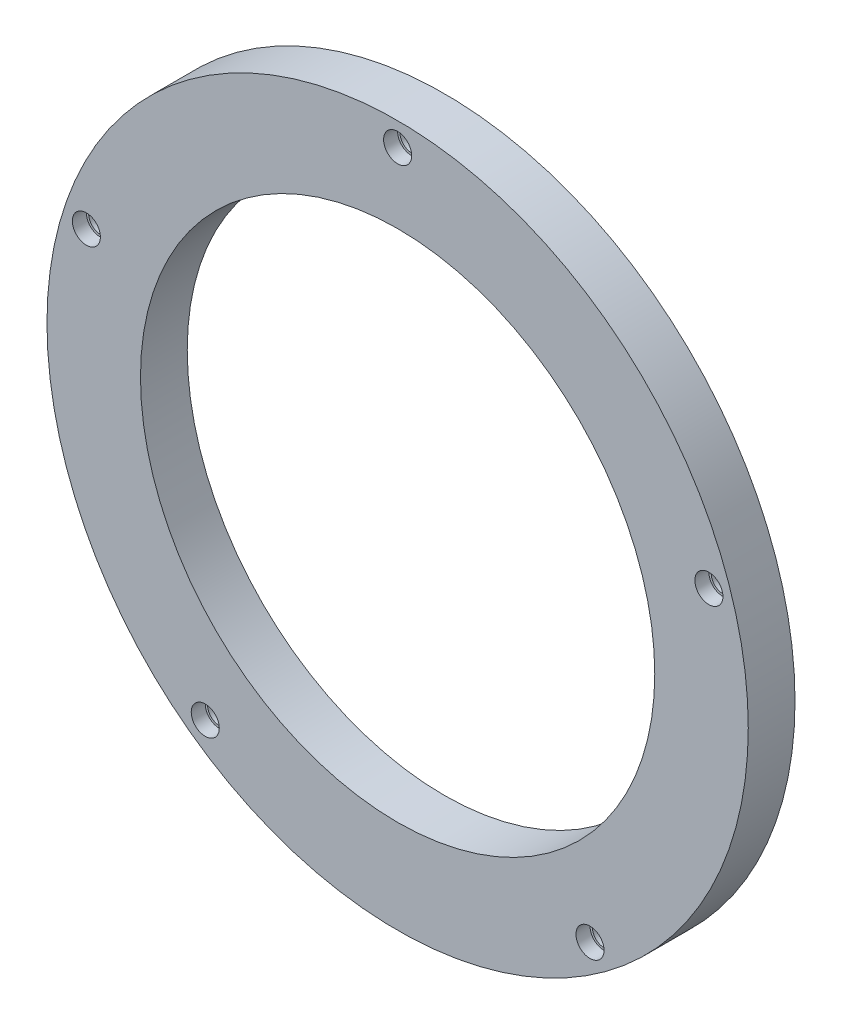
ISO-10303-21;
HEADER;
FILE_DESCRIPTION(('STEP AP214'),'2;1');
FILE_NAME('part.step','',(''),(''),'','','');
FILE_SCHEMA(('AUTOMOTIVE_DESIGN { 1 0 10303 214 1 1 1 1 }'));
ENDSEC;
DATA;
#1=APPLICATION_CONTEXT('core data for automotive mechanical design processes');
#2=APPLICATION_PROTOCOL_DEFINITION('international standard','automotive_design',2000,#1);
#3=PRODUCT_CONTEXT('',#1,'mechanical');
#4=PRODUCT('Part','Part','',(#3));
#5=PRODUCT_RELATED_PRODUCT_CATEGORY('part','',(#4));
#6=PRODUCT_DEFINITION_FORMATION('','',#4);
#7=PRODUCT_DEFINITION_CONTEXT('part definition',#1,'design');
#8=PRODUCT_DEFINITION('design','',#6,#7);
#9=PRODUCT_DEFINITION_SHAPE('','',#8);
#10=(LENGTH_UNIT() NAMED_UNIT(*) SI_UNIT(.MILLI.,.METRE.));
#11=(NAMED_UNIT(*) PLANE_ANGLE_UNIT() SI_UNIT($,.RADIAN.));
#12=(NAMED_UNIT(*) SI_UNIT($,.STERADIAN.) SOLID_ANGLE_UNIT());
#13=UNCERTAINTY_MEASURE_WITH_UNIT(LENGTH_MEASURE(1.E-05),#10,'distance_accuracy_value','');
#14=(GEOMETRIC_REPRESENTATION_CONTEXT(3) GLOBAL_UNCERTAINTY_ASSIGNED_CONTEXT((#13)) GLOBAL_UNIT_ASSIGNED_CONTEXT((#10,
#11,#12)) REPRESENTATION_CONTEXT('',''));
#15=CARTESIAN_POINT('',(0.,0.,0.));
#16=DIRECTION('',(0.,0.,1.));
#17=DIRECTION('',(1.,0.,0.));
#18=AXIS2_PLACEMENT_3D('',#15,#16,#17);
#19=CARTESIAN_POINT('',(0.,0.,10.));
#20=DIRECTION('',(0.,0.,-1.));
#21=DIRECTION('',(-1.,0.,0.));
#22=AXIS2_PLACEMENT_3D('',#19,#20,#21);
#23=CYLINDRICAL_SURFACE('',#22,75.);
#24=CARTESIAN_POINT('',(0.,0.,10.));
#25=DIRECTION('',(0.,0.,1.));
#26=DIRECTION('',(1.,0.,0.));
#27=AXIS2_PLACEMENT_3D('',#24,#25,#26);
#28=CIRCLE('',#27,75.);
#29=CARTESIAN_POINT('',(75.,0.,10.));
#30=VERTEX_POINT('',#29);
#31=EDGE_CURVE('E10',#30,#30,#28,.T.);
#32=ORIENTED_EDGE('',*,*,#31,.F.);
#33=EDGE_LOOP('',(#32));
#34=FACE_BOUND('',#33,.T.);
#35=CARTESIAN_POINT('',(0.,0.,0.));
#36=DIRECTION('',(0.,0.,1.));
#37=DIRECTION('',(1.,0.,0.));
#38=AXIS2_PLACEMENT_3D('',#35,#36,#37);
#39=CIRCLE('',#38,75.);
#40=CARTESIAN_POINT('',(75.,0.,0.));
#41=VERTEX_POINT('',#40);
#42=EDGE_CURVE('E48',#41,#41,#39,.T.);
#43=ORIENTED_EDGE('',*,*,#42,.T.);
#44=EDGE_LOOP('',(#43));
#45=FACE_BOUND('',#44,.T.);
#46=ADVANCED_FACE('F41',(#34,#45),#23,.T.);
#47=CARTESIAN_POINT('',(0.,0.,10.));
#48=DIRECTION('',(0.,0.,1.));
#49=DIRECTION('',(1.,0.,0.));
#50=AXIS2_PLACEMENT_3D('',#47,#48,#49);
#51=PLANE('',#50);
#52=CARTESIAN_POINT('',(66.5739561406609,21.6311896062461,10.));
#53=DIRECTION('',(0.,0.,1.));
#54=DIRECTION('',(0.309016994374945,-0.951056516295155,0.));
#55=AXIS2_PLACEMENT_3D('',#52,#53,#54);
#56=CIRCLE('',#55,3.);
#57=CARTESIAN_POINT('',(67.5010071237857,18.7780200573607,10.));
#58=VERTEX_POINT('',#57);
#59=EDGE_CURVE('E196',#58,#58,#56,.T.);
#60=ORIENTED_EDGE('',*,*,#59,.F.);
#61=EDGE_LOOP('',(#60));
#62=FACE_BOUND('',#61,.T.);
#63=CARTESIAN_POINT('',(41.1449676604728,-56.6311896062466,10.));
#64=DIRECTION('',(0.,0.,1.));
#65=DIRECTION('',(-0.809016994374951,-0.587785252292469,0.));
#66=AXIS2_PLACEMENT_3D('',#63,#64,#65);
#67=CIRCLE('',#66,3.);
#68=CARTESIAN_POINT('',(38.717916677348,-58.394545363124,10.));
#69=VERTEX_POINT('',#68);
#70=EDGE_CURVE('E202',#69,#69,#67,.T.);
#71=ORIENTED_EDGE('',*,*,#70,.F.);
#72=EDGE_LOOP('',(#71));
#73=FACE_BOUND('',#72,.T.);
#74=CARTESIAN_POINT('',(-41.1449676604736,-56.631189606246,10.));
#75=DIRECTION('',(0.,0.,1.));
#76=DIRECTION('',(-0.809016994374942,0.58778525229248,0.));
#77=AXIS2_PLACEMENT_3D('',#74,#75,#76);
#78=CIRCLE('',#77,3.);
#79=CARTESIAN_POINT('',(-43.5720186435985,-54.8678338493685,10.));
#80=VERTEX_POINT('',#79);
#81=EDGE_CURVE('E84',#80,#80,#78,.T.);
#82=ORIENTED_EDGE('',*,*,#81,.F.);
#83=EDGE_LOOP('',(#82));
#84=FACE_BOUND('',#83,.T.);
#85=CARTESIAN_POINT('',(-66.5739561406605,21.6311896062471,10.));
#86=DIRECTION('',(0.,0.,1.));
#87=DIRECTION('',(0.309016994374958,0.95105651629515,0.));
#88=AXIS2_PLACEMENT_3D('',#85,#86,#87);
#89=CIRCLE('',#88,3.);
#90=CARTESIAN_POINT('',(-65.6469051575357,24.4843591551325,10.));
#91=VERTEX_POINT('',#90);
#92=EDGE_CURVE('E75',#91,#91,#89,.T.);
#93=ORIENTED_EDGE('',*,*,#92,.F.);
#94=EDGE_LOOP('',(#93));
#95=FACE_BOUND('',#94,.T.);
#96=CARTESIAN_POINT('',(0.,70.,10.));
#97=DIRECTION('',(0.,0.,1.));
#98=DIRECTION('',(1.,0.,0.));
#99=AXIS2_PLACEMENT_3D('',#96,#97,#98);
#100=CIRCLE('',#99,3.);
#101=CARTESIAN_POINT('',(3.,70.,10.));
#102=VERTEX_POINT('',#101);
#103=EDGE_CURVE('E62',#102,#102,#100,.T.);
#104=ORIENTED_EDGE('',*,*,#103,.F.);
#105=EDGE_LOOP('',(#104));
#106=FACE_BOUND('',#105,.T.);
#107=CARTESIAN_POINT('',(0.,0.,10.));
#108=DIRECTION('',(0.,0.,1.));
#109=DIRECTION('',(1.,0.,0.));
#110=AXIS2_PLACEMENT_3D('',#107,#108,#109);
#111=CIRCLE('',#110,55.);
#112=CARTESIAN_POINT('',(55.,0.,10.));
#113=VERTEX_POINT('',#112);
#114=EDGE_CURVE('E56',#113,#113,#111,.T.);
#115=ORIENTED_EDGE('',*,*,#114,.F.);
#116=EDGE_LOOP('',(#115));
#117=FACE_BOUND('',#116,.T.);
#118=ORIENTED_EDGE('',*,*,#31,.T.);
#119=EDGE_LOOP('',(#118));
#120=FACE_BOUND('',#119,.T.);
#121=ADVANCED_FACE('F103',(#62,#73,#84,#95,#106,#117,#120),#51,.T.);
#122=CARTESIAN_POINT('',(0.,0.,0.));
#123=DIRECTION('',(0.,0.,1.));
#124=DIRECTION('',(1.,0.,0.));
#125=AXIS2_PLACEMENT_3D('',#122,#123,#124);
#126=PLANE('',#125);
#127=CARTESIAN_POINT('',(66.5739561406609,21.6311896062461,0.));
#128=DIRECTION('',(0.,0.,1.));
#129=DIRECTION('',(0.309016994374945,-0.951056516295155,0.));
#130=AXIS2_PLACEMENT_3D('',#127,#128,#129);
#131=CIRCLE('',#130,2.5);
#132=CARTESIAN_POINT('',(67.3464986265982,19.2535483155083,0.));
#133=VERTEX_POINT('',#132);
#134=EDGE_CURVE('E68',#133,#133,#131,.T.);
#135=ORIENTED_EDGE('',*,*,#134,.T.);
#136=EDGE_LOOP('',(#135));
#137=FACE_BOUND('',#136,.T.);
#138=CARTESIAN_POINT('',(41.1449676604728,-56.6311896062466,0.));
#139=DIRECTION('',(0.,0.,1.));
#140=DIRECTION('',(-0.809016994374951,-0.587785252292469,0.));
#141=AXIS2_PLACEMENT_3D('',#138,#139,#140);
#142=CIRCLE('',#141,2.5);
#143=CARTESIAN_POINT('',(39.1224251745354,-58.1006527369777,0.));
#144=VERTEX_POINT('',#143);
#145=EDGE_CURVE('E183',#144,#144,#142,.T.);
#146=ORIENTED_EDGE('',*,*,#145,.T.);
#147=EDGE_LOOP('',(#146));
#148=FACE_BOUND('',#147,.T.);
#149=CARTESIAN_POINT('',(-41.1449676604736,-56.631189606246,0.));
#150=DIRECTION('',(0.,0.,1.));
#151=DIRECTION('',(-0.809016994374942,0.58778525229248,0.));
#152=AXIS2_PLACEMENT_3D('',#149,#150,#151);
#153=CIRCLE('',#152,2.5);
#154=CARTESIAN_POINT('',(-43.167510146411,-55.1617264755148,0.));
#155=VERTEX_POINT('',#154);
#156=EDGE_CURVE('E186',#155,#155,#153,.T.);
#157=ORIENTED_EDGE('',*,*,#156,.T.);
#158=EDGE_LOOP('',(#157));
#159=FACE_BOUND('',#158,.T.);
#160=CARTESIAN_POINT('',(-66.5739561406605,21.6311896062471,0.));
#161=DIRECTION('',(0.,0.,1.));
#162=DIRECTION('',(0.309016994374958,0.95105651629515,0.));
#163=AXIS2_PLACEMENT_3D('',#160,#161,#162);
#164=CIRCLE('',#163,2.5);
#165=CARTESIAN_POINT('',(-65.8014136547231,24.008830896985,0.));
#166=VERTEX_POINT('',#165);
#167=EDGE_CURVE('E191',#166,#166,#164,.T.);
#168=ORIENTED_EDGE('',*,*,#167,.T.);
#169=EDGE_LOOP('',(#168));
#170=FACE_BOUND('',#169,.T.);
#171=CARTESIAN_POINT('',(0.,70.,0.));
#172=DIRECTION('',(0.,0.,1.));
#173=DIRECTION('',(1.,0.,0.));
#174=AXIS2_PLACEMENT_3D('',#171,#172,#173);
#175=CIRCLE('',#174,2.5);
#176=CARTESIAN_POINT('',(2.5,70.,0.));
#177=VERTEX_POINT('',#176);
#178=EDGE_CURVE('E63',#177,#177,#175,.T.);
#179=ORIENTED_EDGE('',*,*,#178,.T.);
#180=EDGE_LOOP('',(#179));
#181=FACE_BOUND('',#180,.T.);
#182=CARTESIAN_POINT('',(0.,0.,0.));
#183=DIRECTION('',(0.,0.,1.));
#184=DIRECTION('',(1.,0.,0.));
#185=AXIS2_PLACEMENT_3D('',#182,#183,#184);
#186=CIRCLE('',#185,55.);
#187=CARTESIAN_POINT('',(55.,0.,0.));
#188=VERTEX_POINT('',#187);
#189=EDGE_CURVE('E53',#188,#188,#186,.T.);
#190=ORIENTED_EDGE('',*,*,#189,.T.);
#191=EDGE_LOOP('',(#190));
#192=FACE_BOUND('',#191,.T.);
#193=ORIENTED_EDGE('',*,*,#42,.F.);
#194=EDGE_LOOP('',(#193));
#195=FACE_BOUND('',#194,.T.);
#196=ADVANCED_FACE('F105',(#137,#148,#159,#170,#181,#192,#195),#126,.F.);
#197=CARTESIAN_POINT('',(0.,0.,0.));
#198=DIRECTION('',(0.,0.,1.));
#199=DIRECTION('',(1.,0.,0.));
#200=AXIS2_PLACEMENT_3D('',#197,#198,#199);
#201=CYLINDRICAL_SURFACE('',#200,55.);
#202=ORIENTED_EDGE('',*,*,#189,.F.);
#203=EDGE_LOOP('',(#202));
#204=FACE_BOUND('',#203,.T.);
#205=ORIENTED_EDGE('',*,*,#114,.T.);
#206=EDGE_LOOP('',(#205));
#207=FACE_BOUND('',#206,.T.);
#208=ADVANCED_FACE('F101',(#204,#207),#201,.F.);
#209=CARTESIAN_POINT('',(0.,70.,7.));
#210=DIRECTION('',(0.,0.,1.));
#211=DIRECTION('',(1.,0.,0.));
#212=AXIS2_PLACEMENT_3D('',#209,#210,#211);
#213=CYLINDRICAL_SURFACE('',#212,3.);
#214=CARTESIAN_POINT('',(0.,70.,7.));
#215=DIRECTION('',(0.,0.,1.));
#216=DIRECTION('',(1.,0.,0.));
#217=AXIS2_PLACEMENT_3D('',#214,#215,#216);
#218=CIRCLE('',#217,3.);
#219=CARTESIAN_POINT('',(3.,70.,7.));
#220=VERTEX_POINT('',#219);
#221=EDGE_CURVE('E91',#220,#220,#218,.T.);
#222=ORIENTED_EDGE('',*,*,#221,.F.);
#223=EDGE_LOOP('',(#222));
#224=FACE_BOUND('',#223,.T.);
#225=ORIENTED_EDGE('',*,*,#103,.T.);
#226=EDGE_LOOP('',(#225));
#227=FACE_BOUND('',#226,.T.);
#228=ADVANCED_FACE('F119',(#224,#227),#213,.F.);
#229=CARTESIAN_POINT('',(0.,70.,7.));
#230=DIRECTION('',(0.,0.,1.));
#231=DIRECTION('',(1.,0.,0.));
#232=AXIS2_PLACEMENT_3D('',#229,#230,#231);
#233=PLANE('',#232);
#234=CARTESIAN_POINT('',(0.,70.,7.));
#235=DIRECTION('',(0.,0.,1.));
#236=DIRECTION('',(1.,0.,0.));
#237=AXIS2_PLACEMENT_3D('',#234,#235,#236);
#238=CIRCLE('',#237,2.5);
#239=CARTESIAN_POINT('',(2.5,70.,7.));
#240=VERTEX_POINT('',#239);
#241=EDGE_CURVE('E59',#240,#240,#238,.T.);
#242=ORIENTED_EDGE('',*,*,#241,.F.);
#243=EDGE_LOOP('',(#242));
#244=FACE_BOUND('',#243,.T.);
#245=ORIENTED_EDGE('',*,*,#221,.T.);
#246=EDGE_LOOP('',(#245));
#247=FACE_BOUND('',#246,.T.);
#248=ADVANCED_FACE('F123',(#244,#247),#233,.T.);
#249=CARTESIAN_POINT('',(0.,70.,0.));
#250=DIRECTION('',(0.,0.,1.));
#251=DIRECTION('',(1.,0.,0.));
#252=AXIS2_PLACEMENT_3D('',#249,#250,#251);
#253=CYLINDRICAL_SURFACE('',#252,2.5);
#254=ORIENTED_EDGE('',*,*,#241,.T.);
#255=EDGE_LOOP('',(#254));
#256=FACE_BOUND('',#255,.T.);
#257=ORIENTED_EDGE('',*,*,#178,.F.);
#258=EDGE_LOOP('',(#257));
#259=FACE_BOUND('',#258,.T.);
#260=ADVANCED_FACE('F127',(#256,#259),#253,.F.);
#261=CARTESIAN_POINT('',(-66.5739561406605,21.6311896062471,7.));
#262=DIRECTION('',(0.,0.,1.));
#263=DIRECTION('',(1.,0.,0.));
#264=AXIS2_PLACEMENT_3D('',#261,#262,#263);
#265=CYLINDRICAL_SURFACE('',#264,3.);
#266=CARTESIAN_POINT('',(-66.5739561406605,21.6311896062471,7.));
#267=DIRECTION('',(0.,0.,1.));
#268=DIRECTION('',(0.309016994374958,0.95105651629515,0.));
#269=AXIS2_PLACEMENT_3D('',#266,#267,#268);
#270=CIRCLE('',#269,3.);
#271=CARTESIAN_POINT('',(-65.6469051575357,24.4843591551325,7.));
#272=VERTEX_POINT('',#271);
#273=EDGE_CURVE('E79',#272,#272,#270,.T.);
#274=ORIENTED_EDGE('',*,*,#273,.F.);
#275=EDGE_LOOP('',(#274));
#276=FACE_BOUND('',#275,.T.);
#277=ORIENTED_EDGE('',*,*,#92,.T.);
#278=EDGE_LOOP('',(#277));
#279=FACE_BOUND('',#278,.T.);
#280=ADVANCED_FACE('F131',(#276,#279),#265,.F.);
#281=CARTESIAN_POINT('',(-66.5739561406605,21.6311896062471,7.));
#282=DIRECTION('',(0.,0.,1.));
#283=DIRECTION('',(0.309016994374958,0.95105651629515,0.));
#284=AXIS2_PLACEMENT_3D('',#281,#282,#283);
#285=PLANE('',#284);
#286=CARTESIAN_POINT('',(-66.5739561406605,21.6311896062471,7.));
#287=DIRECTION('',(0.,0.,1.));
#288=DIRECTION('',(1.,0.,0.));
#289=AXIS2_PLACEMENT_3D('',#286,#287,#288);
#290=CIRCLE('',#289,2.5);
#291=CARTESIAN_POINT('',(-64.0739561406605,21.6311896062471,7.));
#292=VERTEX_POINT('',#291);
#293=EDGE_CURVE('E44',#292,#292,#290,.T.);
#294=ORIENTED_EDGE('',*,*,#293,.F.);
#295=EDGE_LOOP('',(#294));
#296=FACE_BOUND('',#295,.T.);
#297=ORIENTED_EDGE('',*,*,#273,.T.);
#298=EDGE_LOOP('',(#297));
#299=FACE_BOUND('',#298,.T.);
#300=ADVANCED_FACE('F135',(#296,#299),#285,.T.);
#301=CARTESIAN_POINT('',(-41.1449676604736,-56.631189606246,7.));
#302=DIRECTION('',(0.,0.,1.));
#303=DIRECTION('',(1.,0.,0.));
#304=AXIS2_PLACEMENT_3D('',#301,#302,#303);
#305=CYLINDRICAL_SURFACE('',#304,3.);
#306=CARTESIAN_POINT('',(-41.1449676604736,-56.631189606246,7.));
#307=DIRECTION('',(0.,0.,1.));
#308=DIRECTION('',(-0.809016994374942,0.58778525229248,0.));
#309=AXIS2_PLACEMENT_3D('',#306,#307,#308);
#310=CIRCLE('',#309,3.);
#311=CARTESIAN_POINT('',(-43.5720186435985,-54.8678338493685,7.));
#312=VERTEX_POINT('',#311);
#313=EDGE_CURVE('E205',#312,#312,#310,.T.);
#314=ORIENTED_EDGE('',*,*,#313,.F.);
#315=EDGE_LOOP('',(#314));
#316=FACE_BOUND('',#315,.T.);
#317=ORIENTED_EDGE('',*,*,#81,.T.);
#318=EDGE_LOOP('',(#317));
#319=FACE_BOUND('',#318,.T.);
#320=ADVANCED_FACE('F139',(#316,#319),#305,.F.);
#321=CARTESIAN_POINT('',(-41.1449676604736,-56.631189606246,7.));
#322=DIRECTION('',(0.,0.,1.));
#323=DIRECTION('',(-0.809016994374942,0.58778525229248,0.));
#324=AXIS2_PLACEMENT_3D('',#321,#322,#323);
#325=PLANE('',#324);
#326=CARTESIAN_POINT('',(-41.1449676604736,-56.631189606246,7.));
#327=DIRECTION('',(0.,0.,1.));
#328=DIRECTION('',(1.,0.,0.));
#329=AXIS2_PLACEMENT_3D('',#326,#327,#328);
#330=CIRCLE('',#329,2.5);
#331=CARTESIAN_POINT('',(-38.6449676604736,-56.631189606246,7.));
#332=VERTEX_POINT('',#331);
#333=EDGE_CURVE('E70',#332,#332,#330,.T.);
#334=ORIENTED_EDGE('',*,*,#333,.F.);
#335=EDGE_LOOP('',(#334));
#336=FACE_BOUND('',#335,.T.);
#337=ORIENTED_EDGE('',*,*,#313,.T.);
#338=EDGE_LOOP('',(#337));
#339=FACE_BOUND('',#338,.T.);
#340=ADVANCED_FACE('F143',(#336,#339),#325,.T.);
#341=CARTESIAN_POINT('',(41.1449676604728,-56.6311896062466,7.));
#342=DIRECTION('',(0.,0.,1.));
#343=DIRECTION('',(1.,0.,0.));
#344=AXIS2_PLACEMENT_3D('',#341,#342,#343);
#345=CYLINDRICAL_SURFACE('',#344,3.);
#346=CARTESIAN_POINT('',(41.1449676604728,-56.6311896062466,7.));
#347=DIRECTION('',(0.,0.,1.));
#348=DIRECTION('',(-0.809016994374951,-0.587785252292469,0.));
#349=AXIS2_PLACEMENT_3D('',#346,#347,#348);
#350=CIRCLE('',#349,3.);
#351=CARTESIAN_POINT('',(38.717916677348,-58.394545363124,7.));
#352=VERTEX_POINT('',#351);
#353=EDGE_CURVE('E199',#352,#352,#350,.T.);
#354=ORIENTED_EDGE('',*,*,#353,.F.);
#355=EDGE_LOOP('',(#354));
#356=FACE_BOUND('',#355,.T.);
#357=ORIENTED_EDGE('',*,*,#70,.T.);
#358=EDGE_LOOP('',(#357));
#359=FACE_BOUND('',#358,.T.);
#360=ADVANCED_FACE('F147',(#356,#359),#345,.F.);
#361=CARTESIAN_POINT('',(41.1449676604728,-56.6311896062466,7.));
#362=DIRECTION('',(0.,0.,1.));
#363=DIRECTION('',(-0.809016994374951,-0.587785252292469,0.));
#364=AXIS2_PLACEMENT_3D('',#361,#362,#363);
#365=PLANE('',#364);
#366=CARTESIAN_POINT('',(41.1449676604728,-56.6311896062466,7.));
#367=DIRECTION('',(0.,0.,1.));
#368=DIRECTION('',(1.,0.,0.));
#369=AXIS2_PLACEMENT_3D('',#366,#367,#368);
#370=CIRCLE('',#369,2.5);
#371=CARTESIAN_POINT('',(43.6449676604728,-56.6311896062466,7.));
#372=VERTEX_POINT('',#371);
#373=EDGE_CURVE('E67',#372,#372,#370,.T.);
#374=ORIENTED_EDGE('',*,*,#373,.F.);
#375=EDGE_LOOP('',(#374));
#376=FACE_BOUND('',#375,.T.);
#377=ORIENTED_EDGE('',*,*,#353,.T.);
#378=EDGE_LOOP('',(#377));
#379=FACE_BOUND('',#378,.T.);
#380=ADVANCED_FACE('F151',(#376,#379),#365,.T.);
#381=CARTESIAN_POINT('',(66.5739561406609,21.6311896062461,7.));
#382=DIRECTION('',(0.,0.,1.));
#383=DIRECTION('',(1.,0.,0.));
#384=AXIS2_PLACEMENT_3D('',#381,#382,#383);
#385=CYLINDRICAL_SURFACE('',#384,3.);
#386=CARTESIAN_POINT('',(66.5739561406609,21.6311896062461,7.));
#387=DIRECTION('',(0.,0.,1.));
#388=DIRECTION('',(0.309016994374945,-0.951056516295155,0.));
#389=AXIS2_PLACEMENT_3D('',#386,#387,#388);
#390=CIRCLE('',#389,3.);
#391=CARTESIAN_POINT('',(67.5010071237857,18.7780200573607,7.));
#392=VERTEX_POINT('',#391);
#393=EDGE_CURVE('E90',#392,#392,#390,.T.);
#394=ORIENTED_EDGE('',*,*,#393,.F.);
#395=EDGE_LOOP('',(#394));
#396=FACE_BOUND('',#395,.T.);
#397=ORIENTED_EDGE('',*,*,#59,.T.);
#398=EDGE_LOOP('',(#397));
#399=FACE_BOUND('',#398,.T.);
#400=ADVANCED_FACE('F155',(#396,#399),#385,.F.);
#401=CARTESIAN_POINT('',(66.5739561406609,21.6311896062461,7.));
#402=DIRECTION('',(0.,0.,1.));
#403=DIRECTION('',(0.309016994374945,-0.951056516295155,0.));
#404=AXIS2_PLACEMENT_3D('',#401,#402,#403);
#405=PLANE('',#404);
#406=CARTESIAN_POINT('',(66.5739561406609,21.6311896062461,7.));
#407=DIRECTION('',(0.,0.,1.));
#408=DIRECTION('',(1.,0.,0.));
#409=AXIS2_PLACEMENT_3D('',#406,#407,#408);
#410=CIRCLE('',#409,2.5);
#411=CARTESIAN_POINT('',(69.0739561406609,21.6311896062461,7.));
#412=VERTEX_POINT('',#411);
#413=EDGE_CURVE('E64',#412,#412,#410,.T.);
#414=ORIENTED_EDGE('',*,*,#413,.F.);
#415=EDGE_LOOP('',(#414));
#416=FACE_BOUND('',#415,.T.);
#417=ORIENTED_EDGE('',*,*,#393,.T.);
#418=EDGE_LOOP('',(#417));
#419=FACE_BOUND('',#418,.T.);
#420=ADVANCED_FACE('F159',(#416,#419),#405,.T.);
#421=CARTESIAN_POINT('',(66.5739561406609,21.6311896062461,0.));
#422=DIRECTION('',(0.,0.,1.));
#423=DIRECTION('',(1.,0.,0.));
#424=AXIS2_PLACEMENT_3D('',#421,#422,#423);
#425=CYLINDRICAL_SURFACE('',#424,2.5);
#426=ORIENTED_EDGE('',*,*,#413,.T.);
#427=EDGE_LOOP('',(#426));
#428=FACE_BOUND('',#427,.T.);
#429=ORIENTED_EDGE('',*,*,#134,.F.);
#430=EDGE_LOOP('',(#429));
#431=FACE_BOUND('',#430,.T.);
#432=ADVANCED_FACE('F163',(#428,#431),#425,.F.);
#433=CARTESIAN_POINT('',(41.1449676604728,-56.6311896062466,0.));
#434=DIRECTION('',(0.,0.,1.));
#435=DIRECTION('',(1.,0.,0.));
#436=AXIS2_PLACEMENT_3D('',#433,#434,#435);
#437=CYLINDRICAL_SURFACE('',#436,2.5);
#438=ORIENTED_EDGE('',*,*,#373,.T.);
#439=EDGE_LOOP('',(#438));
#440=FACE_BOUND('',#439,.T.);
#441=ORIENTED_EDGE('',*,*,#145,.F.);
#442=EDGE_LOOP('',(#441));
#443=FACE_BOUND('',#442,.T.);
#444=ADVANCED_FACE('F171',(#440,#443),#437,.F.);
#445=CARTESIAN_POINT('',(-41.1449676604736,-56.631189606246,0.));
#446=DIRECTION('',(0.,0.,1.));
#447=DIRECTION('',(1.,0.,0.));
#448=AXIS2_PLACEMENT_3D('',#445,#446,#447);
#449=CYLINDRICAL_SURFACE('',#448,2.5);
#450=ORIENTED_EDGE('',*,*,#333,.T.);
#451=EDGE_LOOP('',(#450));
#452=FACE_BOUND('',#451,.T.);
#453=ORIENTED_EDGE('',*,*,#156,.F.);
#454=EDGE_LOOP('',(#453));
#455=FACE_BOUND('',#454,.T.);
#456=ADVANCED_FACE('F168',(#452,#455),#449,.F.);
#457=CARTESIAN_POINT('',(-66.5739561406605,21.6311896062471,0.));
#458=DIRECTION('',(0.,0.,1.));
#459=DIRECTION('',(1.,0.,0.));
#460=AXIS2_PLACEMENT_3D('',#457,#458,#459);
#461=CYLINDRICAL_SURFACE('',#460,2.5);
#462=ORIENTED_EDGE('',*,*,#293,.T.);
#463=EDGE_LOOP('',(#462));
#464=FACE_BOUND('',#463,.T.);
#465=ORIENTED_EDGE('',*,*,#167,.F.);
#466=EDGE_LOOP('',(#465));
#467=FACE_BOUND('',#466,.T.);
#468=ADVANCED_FACE('F165',(#464,#467),#461,.F.);
#469=CLOSED_SHELL('',(#46,#121,#196,#208,#228,#248,#260,#280,#300,#320,#340,#360,#380,#400,#420,
#432,#444,#456,#468));
#470=MANIFOLD_SOLID_BREP('B2',#469);
#471=ADVANCED_BREP_SHAPE_REPRESENTATION('',(#18,#470),#14);
#472=SHAPE_DEFINITION_REPRESENTATION(#9,#471);
ENDSEC;
END-ISO-10303-21;
